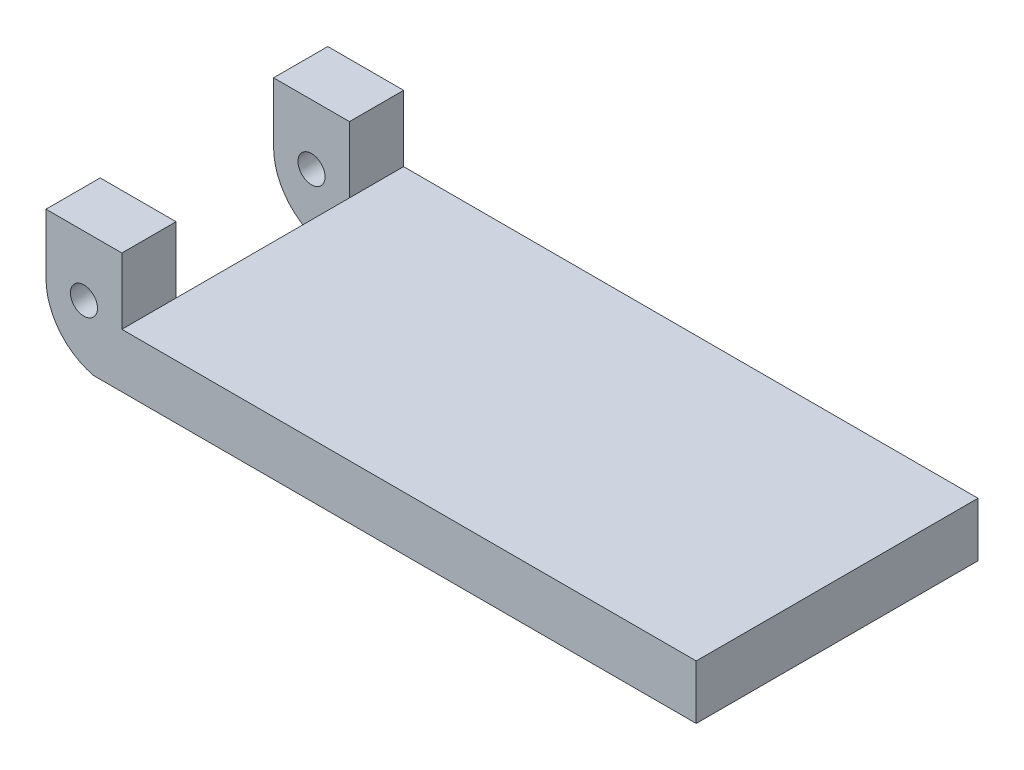
ISO-10303-21;
HEADER;
FILE_DESCRIPTION(('STEP AP214'),'2;1');
FILE_NAME('part.step','',(''),(''),'','','');
FILE_SCHEMA(('AUTOMOTIVE_DESIGN { 1 0 10303 214 1 1 1 1 }'));
ENDSEC;
DATA;
#1=APPLICATION_CONTEXT('core data for automotive mechanical design processes');
#2=APPLICATION_PROTOCOL_DEFINITION('international standard','automotive_design',2000,#1);
#3=PRODUCT_CONTEXT('',#1,'mechanical');
#4=PRODUCT('Part','Part','',(#3));
#5=PRODUCT_RELATED_PRODUCT_CATEGORY('part','',(#4));
#6=PRODUCT_DEFINITION_FORMATION('','',#4);
#7=PRODUCT_DEFINITION_CONTEXT('part definition',#1,'design');
#8=PRODUCT_DEFINITION('design','',#6,#7);
#9=PRODUCT_DEFINITION_SHAPE('','',#8);
#10=(LENGTH_UNIT() NAMED_UNIT(*) SI_UNIT(.MILLI.,.METRE.));
#11=(NAMED_UNIT(*) PLANE_ANGLE_UNIT() SI_UNIT($,.RADIAN.));
#12=(NAMED_UNIT(*) SI_UNIT($,.STERADIAN.) SOLID_ANGLE_UNIT());
#13=UNCERTAINTY_MEASURE_WITH_UNIT(LENGTH_MEASURE(1.E-05),#10,'distance_accuracy_value','');
#14=(GEOMETRIC_REPRESENTATION_CONTEXT(3) GLOBAL_UNCERTAINTY_ASSIGNED_CONTEXT((#13)) GLOBAL_UNIT_ASSIGNED_CONTEXT((#10,
#11,#12)) REPRESENTATION_CONTEXT('',''));
#15=CARTESIAN_POINT('',(0.,0.,0.));
#16=DIRECTION('',(0.,0.,1.));
#17=DIRECTION('',(1.,0.,0.));
#18=AXIS2_PLACEMENT_3D('',#15,#16,#17);
#19=CARTESIAN_POINT('',(0.,0.,-13.));
#20=DIRECTION('',(0.,-1.,0.));
#21=DIRECTION('',(0.,0.,-1.));
#22=AXIS2_PLACEMENT_3D('',#19,#20,#21);
#23=PLANE('',#22);
#24=DIRECTION('',(0.,0.,1.));
#25=VECTOR('',#24,1.);
#26=CARTESIAN_POINT('',(-2.61526428526603,0.,-20.0730807356283));
#27=LINE('',#26,#25);
#28=CARTESIAN_POINT('',(-2.61526428526603,0.,-13.));
#29=VERTEX_POINT('',#28);
#30=CARTESIAN_POINT('',(-2.61526428526603,0.,-8.));
#31=VERTEX_POINT('',#30);
#32=EDGE_CURVE('E220',#29,#31,#27,.T.);
#33=ORIENTED_EDGE('',*,*,#32,.F.);
#34=DIRECTION('',(1.,0.,0.));
#35=VECTOR('',#34,1.);
#36=CARTESIAN_POINT('',(0.,0.,-13.));
#37=LINE('',#36,#35);
#38=CARTESIAN_POINT('',(53.,0.,-13.));
#39=VERTEX_POINT('',#38);
#40=EDGE_CURVE('E306',#29,#39,#37,.T.);
#41=ORIENTED_EDGE('',*,*,#40,.T.);
#42=DIRECTION('',(0.,0.,1.));
#43=VECTOR('',#42,1.);
#44=CARTESIAN_POINT('',(53.,0.,-13.));
#45=LINE('',#44,#43);
#46=CARTESIAN_POINT('',(53.,0.,13.));
#47=VERTEX_POINT('',#46);
#48=EDGE_CURVE('E354',#39,#47,#45,.T.);
#49=ORIENTED_EDGE('',*,*,#48,.T.);
#50=DIRECTION('',(1.,0.,0.));
#51=VECTOR('',#50,1.);
#52=CARTESIAN_POINT('',(0.,0.,13.));
#53=LINE('',#52,#51);
#54=CARTESIAN_POINT('',(-2.61526428526603,0.,13.));
#55=VERTEX_POINT('',#54);
#56=EDGE_CURVE('E183',#55,#47,#53,.T.);
#57=ORIENTED_EDGE('',*,*,#56,.F.);
#58=CARTESIAN_POINT('',(-2.61526428526603,0.,8.));
#59=VERTEX_POINT('',#58);
#60=EDGE_CURVE('E216',#59,#55,#27,.T.);
#61=ORIENTED_EDGE('',*,*,#60,.F.);
#62=DIRECTION('',(1.,0.,0.));
#63=VECTOR('',#62,1.);
#64=CARTESIAN_POINT('',(0.,0.,8.));
#65=LINE('',#64,#63);
#66=CARTESIAN_POINT('',(0.,0.,8.));
#67=VERTEX_POINT('',#66);
#68=EDGE_CURVE('E202',#59,#67,#65,.T.);
#69=ORIENTED_EDGE('',*,*,#68,.T.);
#70=DIRECTION('',(0.,0.,-1.));
#71=VECTOR('',#70,1.);
#72=CARTESIAN_POINT('',(0.,0.,8.));
#73=LINE('',#72,#71);
#74=CARTESIAN_POINT('',(0.,0.,-8.));
#75=VERTEX_POINT('',#74);
#76=EDGE_CURVE('E199',#67,#75,#73,.T.);
#77=ORIENTED_EDGE('',*,*,#76,.T.);
#78=DIRECTION('',(1.,0.,0.));
#79=VECTOR('',#78,1.);
#80=CARTESIAN_POINT('',(0.,0.,-8.));
#81=LINE('',#80,#79);
#82=EDGE_CURVE('E169',#31,#75,#81,.T.);
#83=ORIENTED_EDGE('',*,*,#82,.F.);
#84=EDGE_LOOP('',(#33,#41,#49,#57,#61,#69,#77,#83));
#85=FACE_BOUND('',#84,.T.);
#86=DIRECTION('',(-1.,0.,0.));
#87=VECTOR('',#86,1.);
#88=CARTESIAN_POINT('',(51.5,0.,3.55499999999999));
#89=LINE('',#88,#87);
#90=CARTESIAN_POINT('',(51.5,0.,3.55499999999999));
#91=VERTEX_POINT('',#90);
#92=CARTESIAN_POINT('',(1.5,0.,3.555));
#93=VERTEX_POINT('',#92);
#94=EDGE_CURVE('E248',#91,#93,#89,.T.);
#95=ORIENTED_EDGE('',*,*,#94,.F.);
#96=DIRECTION('',(0.,0.,1.));
#97=VECTOR('',#96,1.);
#98=CARTESIAN_POINT('',(51.5,0.,3.55499999999999));
#99=LINE('',#98,#97);
#100=CARTESIAN_POINT('',(51.5,0.,-3.55500000000001));
#101=VERTEX_POINT('',#100);
#102=EDGE_CURVE('E251',#101,#91,#99,.T.);
#103=ORIENTED_EDGE('',*,*,#102,.F.);
#104=DIRECTION('',(1.,0.,0.));
#105=VECTOR('',#104,1.);
#106=CARTESIAN_POINT('',(51.5,0.,-3.55500000000001));
#107=LINE('',#106,#105);
#108=CARTESIAN_POINT('',(1.5,0.,-3.555));
#109=VERTEX_POINT('',#108);
#110=EDGE_CURVE('E243',#109,#101,#107,.T.);
#111=ORIENTED_EDGE('',*,*,#110,.F.);
#112=DIRECTION('',(0.,0.,-1.));
#113=VECTOR('',#112,1.);
#114=CARTESIAN_POINT('',(1.5,0.,3.555));
#115=LINE('',#114,#113);
#116=EDGE_CURVE('E246',#93,#109,#115,.T.);
#117=ORIENTED_EDGE('',*,*,#116,.F.);
#118=EDGE_LOOP('',(#95,#103,#111,#117));
#119=FACE_BOUND('',#118,.T.);
#120=ADVANCED_FACE('F37',(#85,#119),#23,.T.);
#121=CARTESIAN_POINT('',(0.,11.1,-26.1228807812919));
#122=DIRECTION('',(1.,0.,0.));
#123=DIRECTION('',(0.,1.,0.));
#124=AXIS2_PLACEMENT_3D('',#121,#122,#123);
#125=PLANE('',#124);
#126=DIRECTION('',(0.,0.,1.));
#127=VECTOR('',#126,1.);
#128=CARTESIAN_POINT('',(0.,5.,-13.));
#129=LINE('',#128,#127);
#130=CARTESIAN_POINT('',(0.,5.,8.));
#131=VERTEX_POINT('',#130);
#132=CARTESIAN_POINT('',(0.,5.,13.));
#133=VERTEX_POINT('',#132);
#134=EDGE_CURVE('E329',#131,#133,#129,.T.);
#135=ORIENTED_EDGE('',*,*,#134,.F.);
#136=DIRECTION('',(0.,1.,0.));
#137=VECTOR('',#136,1.);
#138=CARTESIAN_POINT('',(0.,11.1,8.));
#139=LINE('',#138,#137);
#140=CARTESIAN_POINT('',(0.,11.1,8.));
#141=VERTEX_POINT('',#140);
#142=EDGE_CURVE('E211',#131,#141,#139,.T.);
#143=ORIENTED_EDGE('',*,*,#142,.T.);
#144=DIRECTION('',(0.,0.,1.));
#145=VECTOR('',#144,1.);
#146=CARTESIAN_POINT('',(0.,11.1,-26.1228807812919));
#147=LINE('',#146,#145);
#148=CARTESIAN_POINT('',(0.,11.1,13.));
#149=VERTEX_POINT('',#148);
#150=EDGE_CURVE('E184',#141,#149,#147,.T.);
#151=ORIENTED_EDGE('',*,*,#150,.T.);
#152=DIRECTION('',(0.,1.,0.));
#153=VECTOR('',#152,1.);
#154=CARTESIAN_POINT('',(0.,11.1,13.));
#155=LINE('',#154,#153);
#156=EDGE_CURVE('E186',#133,#149,#155,.T.);
#157=ORIENTED_EDGE('',*,*,#156,.F.);
#158=EDGE_LOOP('',(#135,#143,#151,#157));
#159=FACE_BOUND('',#158,.T.);
#160=ADVANCED_FACE('F366',(#159),#125,.T.);
#161=CARTESIAN_POINT('',(0.,11.1,-26.1228807812919));
#162=DIRECTION('',(0.,1.,0.));
#163=DIRECTION('',(-1.,0.,0.));
#164=AXIS2_PLACEMENT_3D('',#161,#162,#163);
#165=PLANE('',#164);
#166=ORIENTED_EDGE('',*,*,#150,.F.);
#167=DIRECTION('',(-1.,0.,0.));
#168=VECTOR('',#167,1.);
#169=CARTESIAN_POINT('',(0.,11.1,8.));
#170=LINE('',#169,#168);
#171=CARTESIAN_POINT('',(-7.,11.1,8.));
#172=VERTEX_POINT('',#171);
#173=EDGE_CURVE('E205',#141,#172,#170,.T.);
#174=ORIENTED_EDGE('',*,*,#173,.T.);
#175=DIRECTION('',(0.,0.,1.));
#176=VECTOR('',#175,1.);
#177=CARTESIAN_POINT('',(-7.,11.1,-26.1228807812919));
#178=LINE('',#177,#176);
#179=CARTESIAN_POINT('',(-7.,11.1,13.));
#180=VERTEX_POINT('',#179);
#181=EDGE_CURVE('E175',#172,#180,#178,.T.);
#182=ORIENTED_EDGE('',*,*,#181,.T.);
#183=DIRECTION('',(-1.,0.,0.));
#184=VECTOR('',#183,1.);
#185=CARTESIAN_POINT('',(0.,11.1,13.));
#186=LINE('',#185,#184);
#187=EDGE_CURVE('E193',#149,#180,#186,.T.);
#188=ORIENTED_EDGE('',*,*,#187,.F.);
#189=EDGE_LOOP('',(#166,#174,#182,#188));
#190=FACE_BOUND('',#189,.T.);
#191=ADVANCED_FACE('F370',(#190),#165,.T.);
#192=CARTESIAN_POINT('',(-7.,11.1,-26.1228807812919));
#193=DIRECTION('',(-1.,0.,0.));
#194=DIRECTION('',(0.,-1.,0.));
#195=AXIS2_PLACEMENT_3D('',#192,#193,#194);
#196=PLANE('',#195);
#197=DIRECTION('',(0.,-1.,0.));
#198=VECTOR('',#197,1.);
#199=CARTESIAN_POINT('',(-7.,11.1,8.));
#200=LINE('',#199,#198);
#201=CARTESIAN_POINT('',(-7.,5.5408979947673,8.));
#202=VERTEX_POINT('',#201);
#203=EDGE_CURVE('E62',#172,#202,#200,.T.);
#204=ORIENTED_EDGE('',*,*,#203,.T.);
#205=DIRECTION('',(0.,0.,1.));
#206=VECTOR('',#205,1.);
#207=CARTESIAN_POINT('',(-7.00000363788174,5.5408979947673,-20.0730807356283));
#208=LINE('',#207,#206);
#209=CARTESIAN_POINT('',(-7.00000363788174,5.5408979947673,13.));
#210=VERTEX_POINT('',#209);
#211=EDGE_CURVE('E334',#210,#202,#208,.F.);
#212=ORIENTED_EDGE('',*,*,#211,.F.);
#213=DIRECTION('',(0.,-1.,0.));
#214=VECTOR('',#213,1.);
#215=CARTESIAN_POINT('',(-7.,11.1,13.));
#216=LINE('',#215,#214);
#217=EDGE_CURVE('E80',#180,#210,#216,.T.);
#218=ORIENTED_EDGE('',*,*,#217,.F.);
#219=ORIENTED_EDGE('',*,*,#181,.F.);
#220=EDGE_LOOP('',(#204,#212,#218,#219));
#221=FACE_BOUND('',#220,.T.);
#222=ADVANCED_FACE('F371',(#221),#196,.T.);
#223=CARTESIAN_POINT('',(0.,5.,-13.));
#224=DIRECTION('',(0.,1.,0.));
#225=DIRECTION('',(0.,0.,1.));
#226=AXIS2_PLACEMENT_3D('',#223,#224,#225);
#227=PLANE('',#226);
#228=CARTESIAN_POINT('',(0.,5.,-13.));
#229=VERTEX_POINT('',#228);
#230=CARTESIAN_POINT('',(0.,5.,-8.));
#231=VERTEX_POINT('',#230);
#232=EDGE_CURVE('E45',#229,#231,#129,.T.);
#233=ORIENTED_EDGE('',*,*,#232,.T.);
#234=DIRECTION('',(0.,0.,1.));
#235=VECTOR('',#234,1.);
#236=CARTESIAN_POINT('',(0.,5.,-13.));
#237=LINE('',#236,#235);
#238=EDGE_CURVE('E196',#231,#131,#237,.T.);
#239=ORIENTED_EDGE('',*,*,#238,.T.);
#240=ORIENTED_EDGE('',*,*,#134,.T.);
#241=DIRECTION('',(-1.,0.,0.));
#242=VECTOR('',#241,1.);
#243=CARTESIAN_POINT('',(0.,5.,13.));
#244=LINE('',#243,#242);
#245=CARTESIAN_POINT('',(53.,5.,13.));
#246=VERTEX_POINT('',#245);
#247=EDGE_CURVE('E313',#246,#133,#244,.T.);
#248=ORIENTED_EDGE('',*,*,#247,.F.);
#249=DIRECTION('',(0.,0.,1.));
#250=VECTOR('',#249,1.);
#251=CARTESIAN_POINT('',(53.,5.,-13.));
#252=LINE('',#251,#250);
#253=CARTESIAN_POINT('',(53.,5.,-13.));
#254=VERTEX_POINT('',#253);
#255=EDGE_CURVE('E324',#254,#246,#252,.T.);
#256=ORIENTED_EDGE('',*,*,#255,.F.);
#257=DIRECTION('',(-1.,0.,0.));
#258=VECTOR('',#257,1.);
#259=CARTESIAN_POINT('',(0.,5.,-13.));
#260=LINE('',#259,#258);
#261=EDGE_CURVE('E315',#254,#229,#260,.T.);
#262=ORIENTED_EDGE('',*,*,#261,.T.);
#263=EDGE_LOOP('',(#233,#239,#240,#248,#256,#262));
#264=FACE_BOUND('',#263,.T.);
#265=ADVANCED_FACE('F352',(#264),#227,.T.);
#266=CARTESIAN_POINT('',(53.,0.,-13.));
#267=DIRECTION('',(1.,0.,0.));
#268=DIRECTION('',(0.,0.,-1.));
#269=AXIS2_PLACEMENT_3D('',#266,#267,#268);
#270=PLANE('',#269);
#271=ORIENTED_EDGE('',*,*,#255,.T.);
#272=DIRECTION('',(0.,1.,0.));
#273=VECTOR('',#272,1.);
#274=CARTESIAN_POINT('',(53.,0.,13.));
#275=LINE('',#274,#273);
#276=EDGE_CURVE('E318',#47,#246,#275,.T.);
#277=ORIENTED_EDGE('',*,*,#276,.F.);
#278=ORIENTED_EDGE('',*,*,#48,.F.);
#279=DIRECTION('',(0.,1.,0.));
#280=VECTOR('',#279,1.);
#281=CARTESIAN_POINT('',(53.,0.,-13.));
#282=LINE('',#281,#280);
#283=EDGE_CURVE('E312',#39,#254,#282,.T.);
#284=ORIENTED_EDGE('',*,*,#283,.T.);
#285=EDGE_LOOP('',(#271,#277,#278,#284));
#286=FACE_BOUND('',#285,.T.);
#287=ADVANCED_FACE('F360',(#286),#270,.T.);
#288=CARTESIAN_POINT('',(0.,0.,-13.));
#289=DIRECTION('',(0.,0.,-1.));
#290=DIRECTION('',(-1.,0.,0.));
#291=AXIS2_PLACEMENT_3D('',#288,#289,#290);
#292=PLANE('',#291);
#293=CARTESIAN_POINT('',(-3.5,5.55,-13.));
#294=DIRECTION('',(0.,0.,-1.));
#295=DIRECTION('',(-1.,0.,0.));
#296=AXIS2_PLACEMENT_3D('',#293,#294,#295);
#297=CIRCLE('',#296,1.25);
#298=CARTESIAN_POINT('',(-4.75,5.55,-13.));
#299=VERTEX_POINT('',#298);
#300=EDGE_CURVE('E226',#299,#299,#297,.F.);
#301=ORIENTED_EDGE('',*,*,#300,.T.);
#302=EDGE_LOOP('',(#301));
#303=FACE_BOUND('',#302,.T.);
#304=CARTESIAN_POINT('',(-1.30668365459173,5.5408979947673,-13.));
#305=DIRECTION('',(0.,0.,-1.));
#306=DIRECTION('',(-1.,0.,0.));
#307=AXIS2_PLACEMENT_3D('',#304,#305,#306);
#308=CIRCLE('',#307,5.69332362117176);
#309=CARTESIAN_POINT('',(-7.00000363788174,5.5408979947673,-13.));
#310=VERTEX_POINT('',#309);
#311=EDGE_CURVE('E219',#29,#310,#308,.T.);
#312=ORIENTED_EDGE('',*,*,#311,.T.);
#313=DIRECTION('',(0.,-1.,0.));
#314=VECTOR('',#313,1.);
#315=CARTESIAN_POINT('',(-7.,11.1,-13.));
#316=LINE('',#315,#314);
#317=CARTESIAN_POINT('',(-7.,11.1,-13.));
#318=VERTEX_POINT('',#317);
#319=EDGE_CURVE('E174',#318,#310,#316,.T.);
#320=ORIENTED_EDGE('',*,*,#319,.F.);
#321=DIRECTION('',(-1.,0.,0.));
#322=VECTOR('',#321,1.);
#323=CARTESIAN_POINT('',(0.,11.1,-13.));
#324=LINE('',#323,#322);
#325=CARTESIAN_POINT('',(0.,11.1,-13.));
#326=VERTEX_POINT('',#325);
#327=EDGE_CURVE('E173',#326,#318,#324,.T.);
#328=ORIENTED_EDGE('',*,*,#327,.F.);
#329=DIRECTION('',(0.,1.,0.));
#330=VECTOR('',#329,1.);
#331=CARTESIAN_POINT('',(0.,11.1,-13.));
#332=LINE('',#331,#330);
#333=EDGE_CURVE('E177',#229,#326,#332,.T.);
#334=ORIENTED_EDGE('',*,*,#333,.F.);
#335=ORIENTED_EDGE('',*,*,#261,.F.);
#336=ORIENTED_EDGE('',*,*,#283,.F.);
#337=ORIENTED_EDGE('',*,*,#40,.F.);
#338=EDGE_LOOP('',(#312,#320,#328,#334,#335,#336,#337));
#339=FACE_BOUND('',#338,.T.);
#340=ADVANCED_FACE('F309',(#303,#339),#292,.T.);
#341=CARTESIAN_POINT('',(0.,0.,13.));
#342=DIRECTION('',(0.,0.,-1.));
#343=DIRECTION('',(-1.,0.,0.));
#344=AXIS2_PLACEMENT_3D('',#341,#342,#343);
#345=PLANE('',#344);
#346=CARTESIAN_POINT('',(-3.5,5.55,13.));
#347=DIRECTION('',(0.,0.,1.));
#348=DIRECTION('',(1.,0.,0.));
#349=AXIS2_PLACEMENT_3D('',#346,#347,#348);
#350=CIRCLE('',#349,1.25);
#351=CARTESIAN_POINT('',(-2.25,5.55,13.));
#352=VERTEX_POINT('',#351);
#353=EDGE_CURVE('E229',#352,#352,#350,.T.);
#354=ORIENTED_EDGE('',*,*,#353,.F.);
#355=EDGE_LOOP('',(#354));
#356=FACE_BOUND('',#355,.T.);
#357=ORIENTED_EDGE('',*,*,#217,.T.);
#358=CARTESIAN_POINT('',(-1.30668365459173,5.5408979947673,13.));
#359=DIRECTION('',(0.,0.,-1.));
#360=DIRECTION('',(1.,0.,0.));
#361=AXIS2_PLACEMENT_3D('',#358,#359,#360);
#362=CIRCLE('',#361,5.69332362117176);
#363=EDGE_CURVE('E214',#55,#210,#362,.T.);
#364=ORIENTED_EDGE('',*,*,#363,.F.);
#365=ORIENTED_EDGE('',*,*,#56,.T.);
#366=ORIENTED_EDGE('',*,*,#276,.T.);
#367=ORIENTED_EDGE('',*,*,#247,.T.);
#368=ORIENTED_EDGE('',*,*,#156,.T.);
#369=ORIENTED_EDGE('',*,*,#187,.T.);
#370=EDGE_LOOP('',(#357,#364,#365,#366,#367,#368,#369));
#371=FACE_BOUND('',#370,.T.);
#372=ADVANCED_FACE('F361',(#356,#371),#345,.F.);
#373=DIRECTION('',(0.,1.,0.));
#374=VECTOR('',#373,1.);
#375=CARTESIAN_POINT('',(0.,11.1,-8.));
#376=LINE('',#375,#374);
#377=CARTESIAN_POINT('',(0.,11.1,-8.));
#378=VERTEX_POINT('',#377);
#379=EDGE_CURVE('E154',#231,#378,#376,.T.);
#380=ORIENTED_EDGE('',*,*,#379,.F.);
#381=ORIENTED_EDGE('',*,*,#232,.F.);
#382=ORIENTED_EDGE('',*,*,#333,.T.);
#383=EDGE_CURVE('E181',#326,#378,#147,.T.);
#384=ORIENTED_EDGE('',*,*,#383,.T.);
#385=EDGE_LOOP('',(#380,#381,#382,#384));
#386=FACE_BOUND('',#385,.T.);
#387=ADVANCED_FACE('F348',(#386),#125,.T.);
#388=DIRECTION('',(-1.,0.,0.));
#389=VECTOR('',#388,1.);
#390=CARTESIAN_POINT('',(0.,11.1,-8.));
#391=LINE('',#390,#389);
#392=CARTESIAN_POINT('',(-7.,11.1,-8.));
#393=VERTEX_POINT('',#392);
#394=EDGE_CURVE('E147',#378,#393,#391,.T.);
#395=ORIENTED_EDGE('',*,*,#394,.F.);
#396=ORIENTED_EDGE('',*,*,#383,.F.);
#397=ORIENTED_EDGE('',*,*,#327,.T.);
#398=EDGE_CURVE('E165',#318,#393,#178,.T.);
#399=ORIENTED_EDGE('',*,*,#398,.T.);
#400=EDGE_LOOP('',(#395,#396,#397,#399));
#401=FACE_BOUND('',#400,.T.);
#402=ADVANCED_FACE('F171',(#401),#165,.T.);
#403=ORIENTED_EDGE('',*,*,#319,.T.);
#404=DIRECTION('',(0.,0.,1.));
#405=VECTOR('',#404,1.);
#406=CARTESIAN_POINT('',(-7.00000363788174,5.5408979947673,-20.0730807356283));
#407=LINE('',#406,#405);
#408=CARTESIAN_POINT('',(-7.,5.5408979947673,-8.));
#409=VERTEX_POINT('',#408);
#410=EDGE_CURVE('E168',#409,#310,#407,.F.);
#411=ORIENTED_EDGE('',*,*,#410,.F.);
#412=DIRECTION('',(0.,-1.,0.));
#413=VECTOR('',#412,1.);
#414=CARTESIAN_POINT('',(-7.,11.1,-8.));
#415=LINE('',#414,#413);
#416=EDGE_CURVE('E150',#393,#409,#415,.T.);
#417=ORIENTED_EDGE('',*,*,#416,.F.);
#418=ORIENTED_EDGE('',*,*,#398,.F.);
#419=EDGE_LOOP('',(#403,#411,#417,#418));
#420=FACE_BOUND('',#419,.T.);
#421=ADVANCED_FACE('F164',(#420),#196,.T.);
#422=CARTESIAN_POINT('',(0.,11.1,8.));
#423=DIRECTION('',(-1.,0.,0.));
#424=DIRECTION('',(0.,-1.,0.));
#425=AXIS2_PLACEMENT_3D('',#422,#423,#424);
#426=PLANE('',#425);
#427=EDGE_CURVE('E159',#75,#231,#376,.T.);
#428=ORIENTED_EDGE('',*,*,#427,.F.);
#429=ORIENTED_EDGE('',*,*,#76,.F.);
#430=EDGE_CURVE('E208',#67,#131,#139,.T.);
#431=ORIENTED_EDGE('',*,*,#430,.T.);
#432=ORIENTED_EDGE('',*,*,#238,.F.);
#433=EDGE_LOOP('',(#428,#429,#431,#432));
#434=FACE_BOUND('',#433,.T.);
#435=ADVANCED_FACE('F344',(#434),#426,.T.);
#436=CARTESIAN_POINT('',(0.,0.,8.));
#437=DIRECTION('',(0.,0.,-1.));
#438=DIRECTION('',(-1.,0.,0.));
#439=AXIS2_PLACEMENT_3D('',#436,#437,#438);
#440=PLANE('',#439);
#441=CARTESIAN_POINT('',(-3.5,5.55,8.));
#442=DIRECTION('',(0.,0.,-1.));
#443=DIRECTION('',(-1.,0.,0.));
#444=AXIS2_PLACEMENT_3D('',#441,#442,#443);
#445=CIRCLE('',#444,1.25);
#446=CARTESIAN_POINT('',(-4.75,5.55,8.));
#447=VERTEX_POINT('',#446);
#448=EDGE_CURVE('E217',#447,#447,#445,.T.);
#449=ORIENTED_EDGE('',*,*,#448,.F.);
#450=EDGE_LOOP('',(#449));
#451=FACE_BOUND('',#450,.T.);
#452=CARTESIAN_POINT('',(-1.30668365459173,5.5408979947673,8.));
#453=DIRECTION('',(0.,0.,-1.));
#454=DIRECTION('',(-1.,0.,0.));
#455=AXIS2_PLACEMENT_3D('',#452,#453,#454);
#456=CIRCLE('',#455,5.69332362117176);
#457=EDGE_CURVE('E90',#202,#59,#456,.F.);
#458=ORIENTED_EDGE('',*,*,#457,.F.);
#459=ORIENTED_EDGE('',*,*,#203,.F.);
#460=ORIENTED_EDGE('',*,*,#173,.F.);
#461=ORIENTED_EDGE('',*,*,#142,.F.);
#462=ORIENTED_EDGE('',*,*,#430,.F.);
#463=ORIENTED_EDGE('',*,*,#68,.F.);
#464=EDGE_LOOP('',(#458,#459,#460,#461,#462,#463));
#465=FACE_BOUND('',#464,.T.);
#466=ADVANCED_FACE('F338',(#451,#465),#440,.T.);
#467=CARTESIAN_POINT('',(0.,0.,-8.));
#468=DIRECTION('',(0.,0.,-1.));
#469=DIRECTION('',(-1.,0.,0.));
#470=AXIS2_PLACEMENT_3D('',#467,#468,#469);
#471=PLANE('',#470);
#472=CARTESIAN_POINT('',(-3.5,5.55,-8.));
#473=DIRECTION('',(0.,0.,-1.));
#474=DIRECTION('',(-1.,0.,0.));
#475=AXIS2_PLACEMENT_3D('',#472,#473,#474);
#476=CIRCLE('',#475,1.25);
#477=CARTESIAN_POINT('',(-4.75,5.55,-8.));
#478=VERTEX_POINT('',#477);
#479=EDGE_CURVE('E40',#478,#478,#476,.T.);
#480=ORIENTED_EDGE('',*,*,#479,.T.);
#481=EDGE_LOOP('',(#480));
#482=FACE_BOUND('',#481,.T.);
#483=ORIENTED_EDGE('',*,*,#416,.T.);
#484=CARTESIAN_POINT('',(-1.30668365459173,5.5408979947673,-8.));
#485=DIRECTION('',(0.,0.,-1.));
#486=DIRECTION('',(-1.,0.,0.));
#487=AXIS2_PLACEMENT_3D('',#484,#485,#486);
#488=CIRCLE('',#487,5.69332362117176);
#489=EDGE_CURVE('E11',#409,#31,#488,.F.);
#490=ORIENTED_EDGE('',*,*,#489,.T.);
#491=ORIENTED_EDGE('',*,*,#82,.T.);
#492=ORIENTED_EDGE('',*,*,#427,.T.);
#493=ORIENTED_EDGE('',*,*,#379,.T.);
#494=ORIENTED_EDGE('',*,*,#394,.T.);
#495=EDGE_LOOP('',(#483,#490,#491,#492,#493,#494));
#496=FACE_BOUND('',#495,.T.);
#497=ADVANCED_FACE('F149',(#482,#496),#471,.F.);
#498=CARTESIAN_POINT('',(-1.30668365459173,5.5408979947673,-20.0730807356283));
#499=DIRECTION('',(0.,0.,1.));
#500=DIRECTION('',(1.,0.,0.));
#501=AXIS2_PLACEMENT_3D('',#498,#499,#500);
#502=CYLINDRICAL_SURFACE('',#501,5.69332362117176);
#503=ORIENTED_EDGE('',*,*,#410,.T.);
#504=ORIENTED_EDGE('',*,*,#311,.F.);
#505=ORIENTED_EDGE('',*,*,#32,.T.);
#506=ORIENTED_EDGE('',*,*,#489,.F.);
#507=EDGE_LOOP('',(#503,#504,#505,#506));
#508=FACE_BOUND('',#507,.T.);
#509=ADVANCED_FACE('F300',(#508),#502,.T.);
#510=ORIENTED_EDGE('',*,*,#211,.T.);
#511=ORIENTED_EDGE('',*,*,#457,.T.);
#512=ORIENTED_EDGE('',*,*,#60,.T.);
#513=ORIENTED_EDGE('',*,*,#363,.T.);
#514=EDGE_LOOP('',(#510,#511,#512,#513));
#515=FACE_BOUND('',#514,.T.);
#516=ADVANCED_FACE('F335',(#515),#502,.T.);
#517=CARTESIAN_POINT('',(-3.5,5.55,-16.5355339059327));
#518=DIRECTION('',(0.,0.,1.));
#519=DIRECTION('',(1.,0.,0.));
#520=AXIS2_PLACEMENT_3D('',#517,#518,#519);
#521=CYLINDRICAL_SURFACE('',#520,1.25);
#522=ORIENTED_EDGE('',*,*,#300,.F.);
#523=EDGE_LOOP('',(#522));
#524=FACE_BOUND('',#523,.T.);
#525=ORIENTED_EDGE('',*,*,#479,.F.);
#526=EDGE_LOOP('',(#525));
#527=FACE_BOUND('',#526,.T.);
#528=ADVANCED_FACE('F452',(#524,#527),#521,.F.);
#529=ORIENTED_EDGE('',*,*,#448,.T.);
#530=EDGE_LOOP('',(#529));
#531=FACE_BOUND('',#530,.T.);
#532=ORIENTED_EDGE('',*,*,#353,.T.);
#533=EDGE_LOOP('',(#532));
#534=FACE_BOUND('',#533,.T.);
#535=ADVANCED_FACE('F456',(#531,#534),#521,.F.);
#536=CARTESIAN_POINT('',(51.5,-0.5,3.55499999999999));
#537=DIRECTION('',(-1.,0.,0.));
#538=DIRECTION('',(0.,0.,1.));
#539=AXIS2_PLACEMENT_3D('',#536,#537,#538);
#540=PLANE('',#539);
#541=ORIENTED_EDGE('',*,*,#102,.T.);
#542=DIRECTION('',(0.,1.,0.));
#543=VECTOR('',#542,1.);
#544=CARTESIAN_POINT('',(51.5,-0.5,3.55499999999999));
#545=LINE('',#544,#543);
#546=CARTESIAN_POINT('',(51.5,-0.5,3.55499999999999));
#547=VERTEX_POINT('',#546);
#548=EDGE_CURVE('E232',#547,#91,#545,.T.);
#549=ORIENTED_EDGE('',*,*,#548,.F.);
#550=DIRECTION('',(0.,0.,1.));
#551=VECTOR('',#550,1.);
#552=CARTESIAN_POINT('',(51.5,-0.5,3.55499999999999));
#553=LINE('',#552,#551);
#554=CARTESIAN_POINT('',(51.5,-0.5,-3.55500000000001));
#555=VERTEX_POINT('',#554);
#556=EDGE_CURVE('E245',#555,#547,#553,.T.);
#557=ORIENTED_EDGE('',*,*,#556,.F.);
#558=DIRECTION('',(0.,1.,0.));
#559=VECTOR('',#558,1.);
#560=CARTESIAN_POINT('',(51.5,-0.5,-3.55500000000001));
#561=LINE('',#560,#559);
#562=EDGE_CURVE('E239',#555,#101,#561,.T.);
#563=ORIENTED_EDGE('',*,*,#562,.T.);
#564=EDGE_LOOP('',(#541,#549,#557,#563));
#565=FACE_BOUND('',#564,.T.);
#566=ADVANCED_FACE('F276',(#565),#540,.F.);
#567=CARTESIAN_POINT('',(51.5,-0.5,3.55499999999999));
#568=DIRECTION('',(0.,0.,-1.));
#569=DIRECTION('',(-1.,0.,0.));
#570=AXIS2_PLACEMENT_3D('',#567,#568,#569);
#571=PLANE('',#570);
#572=ORIENTED_EDGE('',*,*,#94,.T.);
#573=DIRECTION('',(0.,1.,0.));
#574=VECTOR('',#573,1.);
#575=CARTESIAN_POINT('',(1.5,-0.5,3.555));
#576=LINE('',#575,#574);
#577=CARTESIAN_POINT('',(1.5,-0.5,3.555));
#578=VERTEX_POINT('',#577);
#579=EDGE_CURVE('E235',#578,#93,#576,.T.);
#580=ORIENTED_EDGE('',*,*,#579,.F.);
#581=DIRECTION('',(-1.,0.,0.));
#582=VECTOR('',#581,1.);
#583=CARTESIAN_POINT('',(51.5,-0.5,3.55499999999999));
#584=LINE('',#583,#582);
#585=EDGE_CURVE('E259',#547,#578,#584,.T.);
#586=ORIENTED_EDGE('',*,*,#585,.F.);
#587=ORIENTED_EDGE('',*,*,#548,.T.);
#588=EDGE_LOOP('',(#572,#580,#586,#587));
#589=FACE_BOUND('',#588,.T.);
#590=ADVANCED_FACE('F281',(#589),#571,.F.);
#591=CARTESIAN_POINT('',(1.5,-0.5,3.555));
#592=DIRECTION('',(1.,0.,0.));
#593=DIRECTION('',(0.,0.,-1.));
#594=AXIS2_PLACEMENT_3D('',#591,#592,#593);
#595=PLANE('',#594);
#596=ORIENTED_EDGE('',*,*,#116,.T.);
#597=DIRECTION('',(0.,1.,0.));
#598=VECTOR('',#597,1.);
#599=CARTESIAN_POINT('',(1.5,-0.5,-3.555));
#600=LINE('',#599,#598);
#601=CARTESIAN_POINT('',(1.5,-0.5,-3.555));
#602=VERTEX_POINT('',#601);
#603=EDGE_CURVE('E53',#602,#109,#600,.T.);
#604=ORIENTED_EDGE('',*,*,#603,.F.);
#605=DIRECTION('',(0.,0.,-1.));
#606=VECTOR('',#605,1.);
#607=CARTESIAN_POINT('',(1.5,-0.5,3.555));
#608=LINE('',#607,#606);
#609=EDGE_CURVE('E256',#578,#602,#608,.T.);
#610=ORIENTED_EDGE('',*,*,#609,.F.);
#611=ORIENTED_EDGE('',*,*,#579,.T.);
#612=EDGE_LOOP('',(#596,#604,#610,#611));
#613=FACE_BOUND('',#612,.T.);
#614=ADVANCED_FACE('F293',(#613),#595,.F.);
#615=CARTESIAN_POINT('',(51.5,-0.5,-3.55500000000001));
#616=DIRECTION('',(0.,0.,1.));
#617=DIRECTION('',(1.,0.,0.));
#618=AXIS2_PLACEMENT_3D('',#615,#616,#617);
#619=PLANE('',#618);
#620=ORIENTED_EDGE('',*,*,#110,.T.);
#621=ORIENTED_EDGE('',*,*,#562,.F.);
#622=DIRECTION('',(1.,0.,0.));
#623=VECTOR('',#622,1.);
#624=CARTESIAN_POINT('',(51.5,-0.5,-3.55500000000001));
#625=LINE('',#624,#623);
#626=EDGE_CURVE('E242',#602,#555,#625,.T.);
#627=ORIENTED_EDGE('',*,*,#626,.F.);
#628=ORIENTED_EDGE('',*,*,#603,.T.);
#629=EDGE_LOOP('',(#620,#621,#627,#628));
#630=FACE_BOUND('',#629,.T.);
#631=ADVANCED_FACE('F289',(#630),#619,.F.);
#632=CARTESIAN_POINT('',(0.,-0.5,0.));
#633=DIRECTION('',(0.,1.,0.));
#634=DIRECTION('',(0.,0.,1.));
#635=AXIS2_PLACEMENT_3D('',#632,#633,#634);
#636=PLANE('',#635);
#637=ORIENTED_EDGE('',*,*,#556,.T.);
#638=ORIENTED_EDGE('',*,*,#585,.T.);
#639=ORIENTED_EDGE('',*,*,#609,.T.);
#640=ORIENTED_EDGE('',*,*,#626,.T.);
#641=EDGE_LOOP('',(#637,#638,#639,#640));
#642=FACE_BOUND('',#641,.T.);
#643=ADVANCED_FACE('F267',(#642),#636,.F.);
#644=CLOSED_SHELL('',(#120,#160,#191,#222,#265,#287,#340,#372,#387,#402,#421,#435,#466,#497,
#509,#516,#528,#535,#566,#590,#614,#631,#643));
#645=MANIFOLD_SOLID_BREP('B2',#644);
#646=ADVANCED_BREP_SHAPE_REPRESENTATION('',(#18,#645),#14);
#647=SHAPE_DEFINITION_REPRESENTATION(#9,#646);
ENDSEC;
END-ISO-10303-21;
